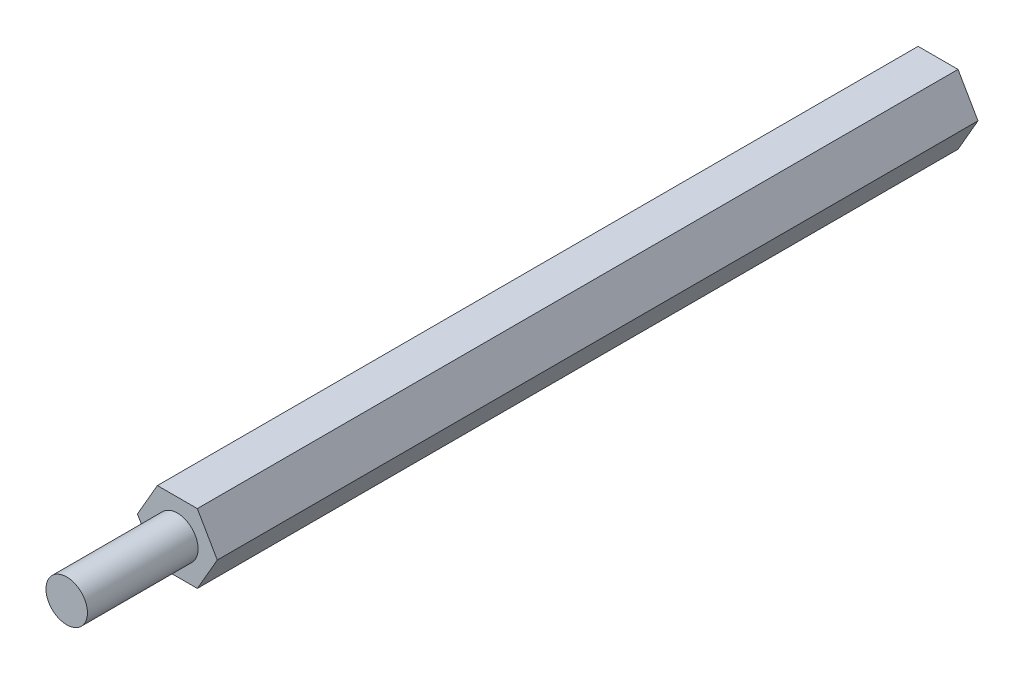
ISO-10303-21;
HEADER;
FILE_DESCRIPTION(('STEP AP214'),'2;1');
FILE_NAME('part.step','',(''),(''),'','','');
FILE_SCHEMA(('AUTOMOTIVE_DESIGN { 1 0 10303 214 1 1 1 1 }'));
ENDSEC;
DATA;
#1=APPLICATION_CONTEXT('core data for automotive mechanical design processes');
#2=APPLICATION_PROTOCOL_DEFINITION('international standard','automotive_design',2000,#1);
#3=PRODUCT_CONTEXT('',#1,'mechanical');
#4=PRODUCT('Part','Part','',(#3));
#5=PRODUCT_RELATED_PRODUCT_CATEGORY('part','',(#4));
#6=PRODUCT_DEFINITION_FORMATION('','',#4);
#7=PRODUCT_DEFINITION_CONTEXT('part definition',#1,'design');
#8=PRODUCT_DEFINITION('design','',#6,#7);
#9=PRODUCT_DEFINITION_SHAPE('','',#8);
#10=(LENGTH_UNIT() NAMED_UNIT(*) SI_UNIT(.MILLI.,.METRE.));
#11=(NAMED_UNIT(*) PLANE_ANGLE_UNIT() SI_UNIT($,.RADIAN.));
#12=(NAMED_UNIT(*) SI_UNIT($,.STERADIAN.) SOLID_ANGLE_UNIT());
#13=UNCERTAINTY_MEASURE_WITH_UNIT(LENGTH_MEASURE(1.E-05),#10,'distance_accuracy_value','');
#14=(GEOMETRIC_REPRESENTATION_CONTEXT(3) GLOBAL_UNCERTAINTY_ASSIGNED_CONTEXT((#13)) GLOBAL_UNIT_ASSIGNED_CONTEXT((#10,
#11,#12)) REPRESENTATION_CONTEXT('',''));
#15=CARTESIAN_POINT('',(0.,0.,0.));
#16=DIRECTION('',(0.,0.,1.));
#17=DIRECTION('',(1.,0.,0.));
#18=AXIS2_PLACEMENT_3D('',#15,#16,#17);
#19=CARTESIAN_POINT('',(1.44337567297406,-2.50000000000001,55.));
#20=DIRECTION('',(0.,0.,1.));
#21=DIRECTION('',(1.,0.,0.));
#22=AXIS2_PLACEMENT_3D('',#19,#20,#21);
#23=PLANE('',#22);
#24=DIRECTION('',(1.,0.,0.));
#25=VECTOR('',#24,1.);
#26=CARTESIAN_POINT('',(-1.44337567297407,-2.5,55.));
#27=LINE('',#26,#25);
#28=CARTESIAN_POINT('',(-1.44337567297407,-2.5,55.));
#29=VERTEX_POINT('',#28);
#30=CARTESIAN_POINT('',(1.44337567297406,-2.50000000000001,55.));
#31=VERTEX_POINT('',#30);
#32=EDGE_CURVE('E115',#29,#31,#27,.T.);
#33=ORIENTED_EDGE('',*,*,#32,.T.);
#34=DIRECTION('',(0.499999999999999,0.866025403784439,0.));
#35=VECTOR('',#34,1.);
#36=CARTESIAN_POINT('',(1.44337567297406,-2.50000000000001,55.));
#37=LINE('',#36,#35);
#38=CARTESIAN_POINT('',(2.88675134594814,0.,55.));
#39=VERTEX_POINT('',#38);
#40=EDGE_CURVE('E117',#31,#39,#37,.T.);
#41=ORIENTED_EDGE('',*,*,#40,.T.);
#42=DIRECTION('',(-0.5,0.866025403784439,0.));
#43=VECTOR('',#42,1.);
#44=CARTESIAN_POINT('',(2.88675134594814,0.,55.));
#45=LINE('',#44,#43);
#46=CARTESIAN_POINT('',(1.44337567297407,2.50000000000002,55.));
#47=VERTEX_POINT('',#46);
#48=EDGE_CURVE('E119',#39,#47,#45,.T.);
#49=ORIENTED_EDGE('',*,*,#48,.T.);
#50=DIRECTION('',(-1.,0.,0.));
#51=VECTOR('',#50,1.);
#52=CARTESIAN_POINT('',(1.44337567297407,2.50000000000002,55.));
#53=LINE('',#52,#51);
#54=CARTESIAN_POINT('',(-1.44337567297407,2.50000000000002,55.));
#55=VERTEX_POINT('',#54);
#56=EDGE_CURVE('E121',#47,#55,#53,.T.);
#57=ORIENTED_EDGE('',*,*,#56,.T.);
#58=DIRECTION('',(-0.500000000000001,-0.866025403784438,0.));
#59=VECTOR('',#58,1.);
#60=CARTESIAN_POINT('',(-1.44337567297407,2.50000000000002,55.));
#61=LINE('',#60,#59);
#62=CARTESIAN_POINT('',(-2.88675134594814,0.,55.));
#63=VERTEX_POINT('',#62);
#64=EDGE_CURVE('E48',#55,#63,#61,.T.);
#65=ORIENTED_EDGE('',*,*,#64,.T.);
#66=DIRECTION('',(0.5,-0.866025403784439,0.));
#67=VECTOR('',#66,1.);
#68=CARTESIAN_POINT('',(-2.88675134594814,0.,55.));
#69=LINE('',#68,#67);
#70=EDGE_CURVE('E43',#63,#29,#69,.T.);
#71=ORIENTED_EDGE('',*,*,#70,.T.);
#72=EDGE_LOOP('',(#33,#41,#49,#57,#65,#71));
#73=FACE_BOUND('',#72,.T.);
#74=CARTESIAN_POINT('',(0.,0.,55.));
#75=DIRECTION('',(0.,0.,1.));
#76=DIRECTION('',(1.,0.,0.));
#77=AXIS2_PLACEMENT_3D('',#74,#75,#76);
#78=CIRCLE('',#77,1.5);
#79=CARTESIAN_POINT('',(1.5,0.,55.));
#80=VERTEX_POINT('',#79);
#81=EDGE_CURVE('E94',#80,#80,#78,.T.);
#82=ORIENTED_EDGE('',*,*,#81,.F.);
#83=EDGE_LOOP('',(#82));
#84=FACE_BOUND('',#83,.T.);
#85=ADVANCED_FACE('F28',(#73,#84),#23,.T.);
#86=CARTESIAN_POINT('',(-1.44337567297407,-2.5,55.));
#87=DIRECTION('',(0.,1.,0.));
#88=DIRECTION('',(-1.,0.,0.));
#89=AXIS2_PLACEMENT_3D('',#86,#87,#88);
#90=PLANE('',#89);
#91=DIRECTION('',(1.,0.,0.));
#92=VECTOR('',#91,1.);
#93=CARTESIAN_POINT('',(-1.44337567297407,-2.5,0.));
#94=LINE('',#93,#92);
#95=CARTESIAN_POINT('',(-1.44337567297407,-2.5,0.));
#96=VERTEX_POINT('',#95);
#97=CARTESIAN_POINT('',(1.44337567297406,-2.50000000000001,0.));
#98=VERTEX_POINT('',#97);
#99=EDGE_CURVE('E102',#96,#98,#94,.T.);
#100=ORIENTED_EDGE('',*,*,#99,.T.);
#101=DIRECTION('',(0.,0.,-1.));
#102=VECTOR('',#101,1.);
#103=CARTESIAN_POINT('',(1.44337567297406,-2.50000000000001,55.));
#104=LINE('',#103,#102);
#105=EDGE_CURVE('E11',#31,#98,#104,.T.);
#106=ORIENTED_EDGE('',*,*,#105,.F.);
#107=ORIENTED_EDGE('',*,*,#32,.F.);
#108=DIRECTION('',(0.,0.,-1.));
#109=VECTOR('',#108,1.);
#110=CARTESIAN_POINT('',(-1.44337567297407,-2.5,55.));
#111=LINE('',#110,#109);
#112=EDGE_CURVE('E125',#29,#96,#111,.T.);
#113=ORIENTED_EDGE('',*,*,#112,.T.);
#114=EDGE_LOOP('',(#100,#106,#107,#113));
#115=FACE_BOUND('',#114,.T.);
#116=ADVANCED_FACE('F30',(#115),#90,.F.);
#117=CARTESIAN_POINT('',(1.44337567297406,-2.50000000000001,55.));
#118=DIRECTION('',(-0.866025403784439,0.499999999999999,0.));
#119=DIRECTION('',(-0.499999999999999,-0.866025403784439,0.));
#120=AXIS2_PLACEMENT_3D('',#117,#118,#119);
#121=PLANE('',#120);
#122=DIRECTION('',(0.499999999999999,0.866025403784439,0.));
#123=VECTOR('',#122,1.);
#124=CARTESIAN_POINT('',(1.44337567297406,-2.50000000000001,0.));
#125=LINE('',#124,#123);
#126=CARTESIAN_POINT('',(2.88675134594814,0.,0.));
#127=VERTEX_POINT('',#126);
#128=EDGE_CURVE('E105',#98,#127,#125,.T.);
#129=ORIENTED_EDGE('',*,*,#128,.T.);
#130=DIRECTION('',(0.,0.,-1.));
#131=VECTOR('',#130,1.);
#132=CARTESIAN_POINT('',(2.88675134594814,0.,55.));
#133=LINE('',#132,#131);
#134=EDGE_CURVE('E36',#39,#127,#133,.T.);
#135=ORIENTED_EDGE('',*,*,#134,.F.);
#136=ORIENTED_EDGE('',*,*,#40,.F.);
#137=ORIENTED_EDGE('',*,*,#105,.T.);
#138=EDGE_LOOP('',(#129,#135,#136,#137));
#139=FACE_BOUND('',#138,.T.);
#140=ADVANCED_FACE('F162',(#139),#121,.F.);
#141=CARTESIAN_POINT('',(2.88675134594814,0.,55.));
#142=DIRECTION('',(-0.866025403784439,-0.5,0.));
#143=DIRECTION('',(0.5,-0.866025403784439,0.));
#144=AXIS2_PLACEMENT_3D('',#141,#142,#143);
#145=PLANE('',#144);
#146=DIRECTION('',(-0.5,0.866025403784439,0.));
#147=VECTOR('',#146,1.);
#148=CARTESIAN_POINT('',(2.88675134594814,0.,0.));
#149=LINE('',#148,#147);
#150=CARTESIAN_POINT('',(1.44337567297407,2.50000000000002,0.));
#151=VERTEX_POINT('',#150);
#152=EDGE_CURVE('E107',#127,#151,#149,.T.);
#153=ORIENTED_EDGE('',*,*,#152,.T.);
#154=DIRECTION('',(0.,0.,-1.));
#155=VECTOR('',#154,1.);
#156=CARTESIAN_POINT('',(1.44337567297407,2.50000000000002,55.));
#157=LINE('',#156,#155);
#158=EDGE_CURVE('E134',#47,#151,#157,.T.);
#159=ORIENTED_EDGE('',*,*,#158,.F.);
#160=ORIENTED_EDGE('',*,*,#48,.F.);
#161=ORIENTED_EDGE('',*,*,#134,.T.);
#162=EDGE_LOOP('',(#153,#159,#160,#161));
#163=FACE_BOUND('',#162,.T.);
#164=ADVANCED_FACE('F141',(#163),#145,.F.);
#165=CARTESIAN_POINT('',(1.44337567297407,2.50000000000002,55.));
#166=DIRECTION('',(0.,-1.,0.));
#167=DIRECTION('',(1.,0.,0.));
#168=AXIS2_PLACEMENT_3D('',#165,#166,#167);
#169=PLANE('',#168);
#170=DIRECTION('',(-1.,0.,0.));
#171=VECTOR('',#170,1.);
#172=CARTESIAN_POINT('',(1.44337567297407,2.50000000000002,0.));
#173=LINE('',#172,#171);
#174=CARTESIAN_POINT('',(-1.44337567297407,2.50000000000002,0.));
#175=VERTEX_POINT('',#174);
#176=EDGE_CURVE('E109',#151,#175,#173,.T.);
#177=ORIENTED_EDGE('',*,*,#176,.T.);
#178=DIRECTION('',(0.,0.,-1.));
#179=VECTOR('',#178,1.);
#180=CARTESIAN_POINT('',(-1.44337567297407,2.50000000000002,55.));
#181=LINE('',#180,#179);
#182=EDGE_CURVE('E131',#55,#175,#181,.T.);
#183=ORIENTED_EDGE('',*,*,#182,.F.);
#184=ORIENTED_EDGE('',*,*,#56,.F.);
#185=ORIENTED_EDGE('',*,*,#158,.T.);
#186=EDGE_LOOP('',(#177,#183,#184,#185));
#187=FACE_BOUND('',#186,.T.);
#188=ADVANCED_FACE('F152',(#187),#169,.F.);
#189=CARTESIAN_POINT('',(-1.44337567297407,2.50000000000002,55.));
#190=DIRECTION('',(0.866025403784438,-0.500000000000001,0.));
#191=DIRECTION('',(0.500000000000001,0.866025403784438,0.));
#192=AXIS2_PLACEMENT_3D('',#189,#190,#191);
#193=PLANE('',#192);
#194=DIRECTION('',(-0.500000000000001,-0.866025403784438,0.));
#195=VECTOR('',#194,1.);
#196=CARTESIAN_POINT('',(-1.44337567297407,2.50000000000002,0.));
#197=LINE('',#196,#195);
#198=CARTESIAN_POINT('',(-2.88675134594814,0.,0.));
#199=VERTEX_POINT('',#198);
#200=EDGE_CURVE('E111',#175,#199,#197,.T.);
#201=ORIENTED_EDGE('',*,*,#200,.T.);
#202=DIRECTION('',(0.,0.,-1.));
#203=VECTOR('',#202,1.);
#204=CARTESIAN_POINT('',(-2.88675134594814,0.,55.));
#205=LINE('',#204,#203);
#206=EDGE_CURVE('E128',#63,#199,#205,.T.);
#207=ORIENTED_EDGE('',*,*,#206,.F.);
#208=ORIENTED_EDGE('',*,*,#64,.F.);
#209=ORIENTED_EDGE('',*,*,#182,.T.);
#210=EDGE_LOOP('',(#201,#207,#208,#209));
#211=FACE_BOUND('',#210,.T.);
#212=ADVANCED_FACE('F155',(#211),#193,.F.);
#213=CARTESIAN_POINT('',(-2.88675134594814,0.,55.));
#214=DIRECTION('',(0.866025403784439,0.5,0.));
#215=DIRECTION('',(-0.5,0.866025403784439,0.));
#216=AXIS2_PLACEMENT_3D('',#213,#214,#215);
#217=PLANE('',#216);
#218=DIRECTION('',(0.5,-0.866025403784439,0.));
#219=VECTOR('',#218,1.);
#220=CARTESIAN_POINT('',(-2.88675134594814,0.,0.));
#221=LINE('',#220,#219);
#222=EDGE_CURVE('E113',#199,#96,#221,.T.);
#223=ORIENTED_EDGE('',*,*,#222,.T.);
#224=ORIENTED_EDGE('',*,*,#112,.F.);
#225=ORIENTED_EDGE('',*,*,#70,.F.);
#226=ORIENTED_EDGE('',*,*,#206,.T.);
#227=EDGE_LOOP('',(#223,#224,#225,#226));
#228=FACE_BOUND('',#227,.T.);
#229=ADVANCED_FACE('F157',(#228),#217,.F.);
#230=CARTESIAN_POINT('',(1.44337567297406,-2.50000000000001,0.));
#231=DIRECTION('',(0.,0.,1.));
#232=DIRECTION('',(1.,0.,0.));
#233=AXIS2_PLACEMENT_3D('',#230,#231,#232);
#234=PLANE('',#233);
#235=CARTESIAN_POINT('',(0.,0.,0.));
#236=DIRECTION('',(0.,0.,-1.));
#237=DIRECTION('',(-1.,0.,0.));
#238=AXIS2_PLACEMENT_3D('',#235,#236,#237);
#239=CIRCLE('',#238,1.24999999999999);
#240=CARTESIAN_POINT('',(-1.24999999999999,0.,0.));
#241=VERTEX_POINT('',#240);
#242=EDGE_CURVE('E91',#241,#241,#239,.T.);
#243=ORIENTED_EDGE('',*,*,#242,.F.);
#244=EDGE_LOOP('',(#243));
#245=FACE_BOUND('',#244,.T.);
#246=ORIENTED_EDGE('',*,*,#99,.F.);
#247=ORIENTED_EDGE('',*,*,#222,.F.);
#248=ORIENTED_EDGE('',*,*,#200,.F.);
#249=ORIENTED_EDGE('',*,*,#176,.F.);
#250=ORIENTED_EDGE('',*,*,#152,.F.);
#251=ORIENTED_EDGE('',*,*,#128,.F.);
#252=EDGE_LOOP('',(#246,#247,#248,#249,#250,#251));
#253=FACE_BOUND('',#252,.T.);
#254=ADVANCED_FACE('F147',(#245,#253),#234,.F.);
#255=CARTESIAN_POINT('',(0.,0.,63.));
#256=DIRECTION('',(0.,0.,-1.));
#257=DIRECTION('',(-1.,0.,0.));
#258=AXIS2_PLACEMENT_3D('',#255,#256,#257);
#259=CYLINDRICAL_SURFACE('',#258,1.5);
#260=CARTESIAN_POINT('',(0.,0.,63.));
#261=DIRECTION('',(0.,0.,1.));
#262=DIRECTION('',(1.,0.,0.));
#263=AXIS2_PLACEMENT_3D('',#260,#261,#262);
#264=CIRCLE('',#263,1.5);
#265=CARTESIAN_POINT('',(1.5,0.,63.));
#266=VERTEX_POINT('',#265);
#267=EDGE_CURVE('E99',#266,#266,#264,.T.);
#268=ORIENTED_EDGE('',*,*,#267,.F.);
#269=EDGE_LOOP('',(#268));
#270=FACE_BOUND('',#269,.T.);
#271=ORIENTED_EDGE('',*,*,#81,.T.);
#272=EDGE_LOOP('',(#271));
#273=FACE_BOUND('',#272,.T.);
#274=ADVANCED_FACE('F200',(#270,#273),#259,.T.);
#275=CARTESIAN_POINT('',(0.,0.,63.));
#276=DIRECTION('',(0.,0.,1.));
#277=DIRECTION('',(1.,0.,0.));
#278=AXIS2_PLACEMENT_3D('',#275,#276,#277);
#279=PLANE('',#278);
#280=ORIENTED_EDGE('',*,*,#267,.T.);
#281=EDGE_LOOP('',(#280));
#282=FACE_BOUND('',#281,.T.);
#283=ADVANCED_FACE('F211',(#282),#279,.T.);
#284=CARTESIAN_POINT('',(0.,0.,0.));
#285=DIRECTION('',(0.,0.,-1.));
#286=DIRECTION('',(-1.,0.,0.));
#287=AXIS2_PLACEMENT_3D('',#284,#285,#286);
#288=CYLINDRICAL_SURFACE('',#287,1.24999999999999);
#289=CARTESIAN_POINT('',(0.,0.,11.));
#290=DIRECTION('',(0.,0.,-1.));
#291=DIRECTION('',(-1.,0.,0.));
#292=AXIS2_PLACEMENT_3D('',#289,#290,#291);
#293=CIRCLE('',#292,1.25);
#294=CARTESIAN_POINT('',(-1.25,0.,11.));
#295=VERTEX_POINT('',#294);
#296=EDGE_CURVE('E89',#295,#295,#293,.T.);
#297=ORIENTED_EDGE('',*,*,#296,.F.);
#298=EDGE_LOOP('',(#297));
#299=FACE_BOUND('',#298,.T.);
#300=ORIENTED_EDGE('',*,*,#242,.T.);
#301=EDGE_LOOP('',(#300));
#302=FACE_BOUND('',#301,.T.);
#303=ADVANCED_FACE('F85',(#299,#302),#288,.F.);
#304=CARTESIAN_POINT('',(0.,0.,11.));
#305=DIRECTION('',(0.,0.,-1.));
#306=DIRECTION('',(-1.,0.,0.));
#307=AXIS2_PLACEMENT_3D('',#304,#305,#306);
#308=CONICAL_SURFACE('',#307,1.25,1.02974425867665);
#309=CARTESIAN_POINT('',(0.,0.,11.7510757737845));
#310=VERTEX_POINT('',#309);
#311=VERTEX_LOOP('',#310);
#312=FACE_BOUND('',#311,.T.);
#313=ORIENTED_EDGE('',*,*,#296,.T.);
#314=EDGE_LOOP('',(#313));
#315=FACE_BOUND('',#314,.T.);
#316=ADVANCED_FACE('F82',(#312,#315),#308,.F.);
#317=CLOSED_SHELL('',(#85,#116,#140,#164,#188,#212,#229,#254,#274,#283,#303,#316));
#318=MANIFOLD_SOLID_BREP('B2',#317);
#319=ADVANCED_BREP_SHAPE_REPRESENTATION('',(#18,#318),#14);
#320=SHAPE_DEFINITION_REPRESENTATION(#9,#319);
ENDSEC;
END-ISO-10303-21;
